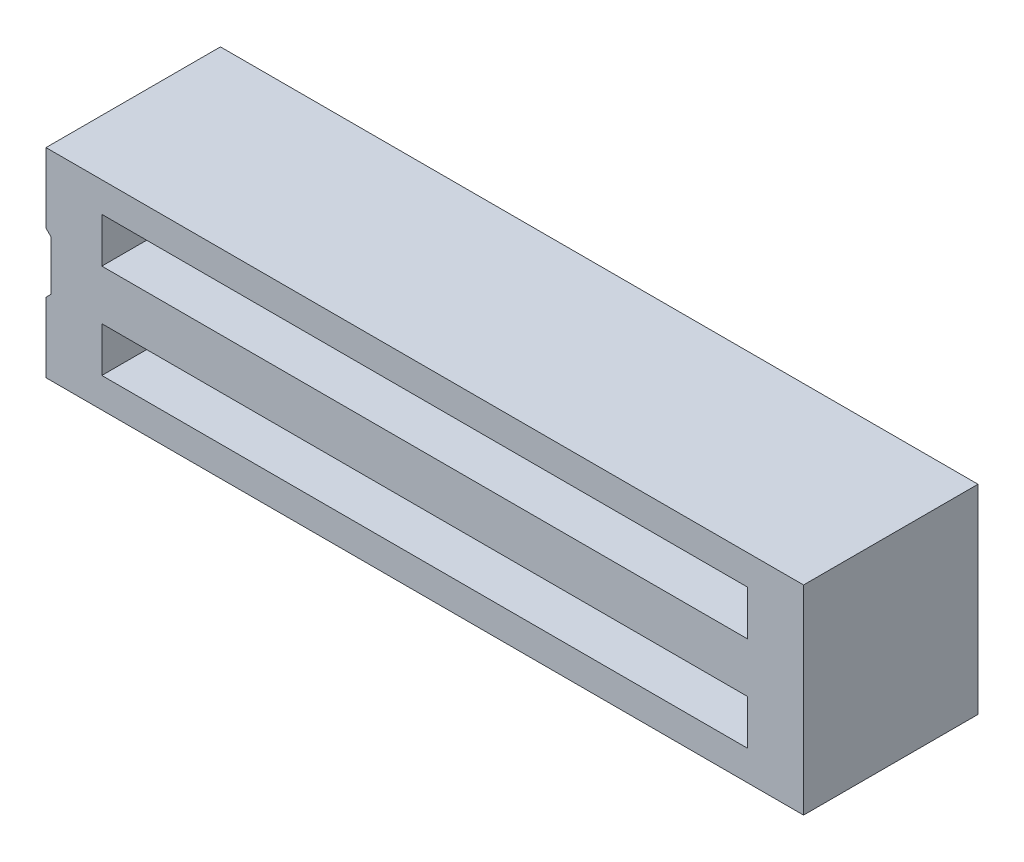
ISO-10303-21;
HEADER;
FILE_DESCRIPTION(('STEP AP214'),'2;1');
FILE_NAME('part.step','',(''),(''),'','','');
FILE_SCHEMA(('AUTOMOTIVE_DESIGN { 1 0 10303 214 1 1 1 1 }'));
ENDSEC;
DATA;
#1=APPLICATION_CONTEXT('core data for automotive mechanical design processes');
#2=APPLICATION_PROTOCOL_DEFINITION('international standard','automotive_design',2000,#1);
#3=PRODUCT_CONTEXT('',#1,'mechanical');
#4=PRODUCT('Part','Part','',(#3));
#5=PRODUCT_RELATED_PRODUCT_CATEGORY('part','',(#4));
#6=PRODUCT_DEFINITION_FORMATION('','',#4);
#7=PRODUCT_DEFINITION_CONTEXT('part definition',#1,'design');
#8=PRODUCT_DEFINITION('design','',#6,#7);
#9=PRODUCT_DEFINITION_SHAPE('','',#8);
#10=(LENGTH_UNIT() NAMED_UNIT(*) SI_UNIT(.MILLI.,.METRE.));
#11=(NAMED_UNIT(*) PLANE_ANGLE_UNIT() SI_UNIT($,.RADIAN.));
#12=(NAMED_UNIT(*) SI_UNIT($,.STERADIAN.) SOLID_ANGLE_UNIT());
#13=UNCERTAINTY_MEASURE_WITH_UNIT(LENGTH_MEASURE(1.E-05),#10,'distance_accuracy_value','');
#14=(GEOMETRIC_REPRESENTATION_CONTEXT(3) GLOBAL_UNCERTAINTY_ASSIGNED_CONTEXT((#13)) GLOBAL_UNIT_ASSIGNED_CONTEXT((#10,
#11,#12)) REPRESENTATION_CONTEXT('',''));
#15=CARTESIAN_POINT('',(0.,0.,0.));
#16=DIRECTION('',(0.,0.,1.));
#17=DIRECTION('',(1.,0.,0.));
#18=AXIS2_PLACEMENT_3D('',#15,#16,#17);
#19=CARTESIAN_POINT('',(6.48,0.49,3.51));
#20=CARTESIAN_POINT('',(6.48,0.49,0.49));
#21=CARTESIAN_POINT('',(6.48,1.41,3.51));
#22=CARTESIAN_POINT('',(6.48,1.41,0.49));
#23=(BOUNDED_SURFACE() B_SPLINE_SURFACE(1,1,((#19,#20),(#21,#22)),.UNSPECIFIED.,.F.,.F.,
.F.) B_SPLINE_SURFACE_WITH_KNOTS((2,2),(2,2),(-0.001,0.091),(-0.001,0.301),
.UNSPECIFIED.) GEOMETRIC_REPRESENTATION_ITEM() RATIONAL_B_SPLINE_SURFACE(((1.,1.),(1.,1.))) REPRESENTATION_ITEM('') SURFACE());
#24=CARTESIAN_POINT('',(6.48,1.4,3.5));
#25=CARTESIAN_POINT('',(6.48,0.5,3.5));
#26=(BOUNDED_CURVE() B_SPLINE_CURVE(1,(#24,#25),.UNSPECIFIED.,.F.,
.F.) B_SPLINE_CURVE_WITH_KNOTS((2,2),(-0.07,0.02),
.UNSPECIFIED.) CURVE() GEOMETRIC_REPRESENTATION_ITEM() RATIONAL_B_SPLINE_CURVE((1.,1.)) REPRESENTATION_ITEM(''));
#27=CARTESIAN_POINT('',(6.48,1.4,3.5));
#28=VERTEX_POINT('',#27);
#29=CARTESIAN_POINT('',(6.48,0.5,3.5));
#30=VERTEX_POINT('',#29);
#31=EDGE_CURVE('E219',#28,#30,#26,.T.);
#32=CARTESIAN_POINT('',(6.48,1.4,3.5));
#33=CARTESIAN_POINT('',(6.48,1.4,0.5));
#34=(BOUNDED_CURVE() B_SPLINE_CURVE(1,(#32,#33),.UNSPECIFIED.,.F.,
.F.) B_SPLINE_CURVE_WITH_KNOTS((2,2),(0.,0.3),
.UNSPECIFIED.) CURVE() GEOMETRIC_REPRESENTATION_ITEM() RATIONAL_B_SPLINE_CURVE((1.,1.)) REPRESENTATION_ITEM(''));
#35=CARTESIAN_POINT('',(6.48,1.4,0.5));
#36=VERTEX_POINT('',#35);
#37=EDGE_CURVE('E11',#28,#36,#34,.T.);
#38=CARTESIAN_POINT('',(6.48,1.4,0.5));
#39=CARTESIAN_POINT('',(6.48,0.5,0.5));
#40=(BOUNDED_CURVE() B_SPLINE_CURVE(1,(#38,#39),.UNSPECIFIED.,.F.,
.F.) B_SPLINE_CURVE_WITH_KNOTS((2,2),(0.,0.09),
.UNSPECIFIED.) CURVE() GEOMETRIC_REPRESENTATION_ITEM() RATIONAL_B_SPLINE_CURVE((1.,1.)) REPRESENTATION_ITEM(''));
#41=CARTESIAN_POINT('',(6.48,0.5,0.5));
#42=VERTEX_POINT('',#41);
#43=EDGE_CURVE('E209',#36,#42,#40,.T.);
#44=CARTESIAN_POINT('',(6.48,0.5,3.5));
#45=CARTESIAN_POINT('',(6.48,0.5,0.5));
#46=(BOUNDED_CURVE() B_SPLINE_CURVE(1,(#44,#45),.UNSPECIFIED.,.F.,
.F.) B_SPLINE_CURVE_WITH_KNOTS((2,2),(0.,0.3),
.UNSPECIFIED.) CURVE() GEOMETRIC_REPRESENTATION_ITEM() RATIONAL_B_SPLINE_CURVE((1.,1.)) REPRESENTATION_ITEM(''));
#47=EDGE_CURVE('E481',#30,#42,#46,.T.);
#48=ORIENTED_EDGE('',*,*,#31,.F.);
#49=ORIENTED_EDGE('',*,*,#37,.T.);
#50=ORIENTED_EDGE('',*,*,#43,.T.);
#51=ORIENTED_EDGE('',*,*,#47,.F.);
#52=EDGE_LOOP('',(#48,#49,#50,#51));
#53=FACE_BOUND('',#52,.T.);
#54=ADVANCED_FACE('F17',(#53),#23,.T.);
#55=CARTESIAN_POINT('',(6.49,1.4,3.51));
#56=CARTESIAN_POINT('',(6.49,1.4,0.49));
#57=CARTESIAN_POINT('',(-6.49,1.4,3.51));
#58=CARTESIAN_POINT('',(-6.49,1.4,0.49));
#59=(BOUNDED_SURFACE() B_SPLINE_SURFACE(1,1,((#55,#56),(#57,#58)),.UNSPECIFIED.,.F.,.F.,
.F.) B_SPLINE_SURFACE_WITH_KNOTS((2,2),(2,2),(-0.001,1.297),(-0.001,0.301),
.UNSPECIFIED.) GEOMETRIC_REPRESENTATION_ITEM() RATIONAL_B_SPLINE_SURFACE(((1.,1.),(1.,1.))) REPRESENTATION_ITEM('') SURFACE());
#60=CARTESIAN_POINT('',(-6.48,1.4,3.5));
#61=CARTESIAN_POINT('',(6.48,1.4,3.5));
#62=(BOUNDED_CURVE() B_SPLINE_CURVE(1,(#60,#61),.UNSPECIFIED.,.F.,
.F.) B_SPLINE_CURVE_WITH_KNOTS((2,2),(-0.324,0.972),
.UNSPECIFIED.) CURVE() GEOMETRIC_REPRESENTATION_ITEM() RATIONAL_B_SPLINE_CURVE((1.,1.)) REPRESENTATION_ITEM(''));
#63=CARTESIAN_POINT('',(-6.48,1.4,3.5));
#64=VERTEX_POINT('',#63);
#65=EDGE_CURVE('E277',#64,#28,#62,.T.);
#66=CARTESIAN_POINT('',(-6.48,1.4,3.5));
#67=CARTESIAN_POINT('',(-6.48,1.4,0.5));
#68=(BOUNDED_CURVE() B_SPLINE_CURVE(1,(#66,#67),.UNSPECIFIED.,.F.,
.F.) B_SPLINE_CURVE_WITH_KNOTS((2,2),(0.,0.3),
.UNSPECIFIED.) CURVE() GEOMETRIC_REPRESENTATION_ITEM() RATIONAL_B_SPLINE_CURVE((1.,1.)) REPRESENTATION_ITEM(''));
#69=CARTESIAN_POINT('',(-6.48,1.4,0.5));
#70=VERTEX_POINT('',#69);
#71=EDGE_CURVE('E23',#64,#70,#68,.T.);
#72=CARTESIAN_POINT('',(-6.48,1.4,0.5));
#73=CARTESIAN_POINT('',(6.48,1.4,0.5));
#74=(BOUNDED_CURVE() B_SPLINE_CURVE(1,(#72,#73),.UNSPECIFIED.,.F.,
.F.) B_SPLINE_CURVE_WITH_KNOTS((2,2),(0.,1.296),
.UNSPECIFIED.) CURVE() GEOMETRIC_REPRESENTATION_ITEM() RATIONAL_B_SPLINE_CURVE((1.,1.)) REPRESENTATION_ITEM(''));
#75=EDGE_CURVE('E200',#70,#36,#74,.T.);
#76=ORIENTED_EDGE('',*,*,#65,.F.);
#77=ORIENTED_EDGE('',*,*,#71,.T.);
#78=ORIENTED_EDGE('',*,*,#75,.T.);
#79=ORIENTED_EDGE('',*,*,#37,.F.);
#80=EDGE_LOOP('',(#76,#77,#78,#79));
#81=FACE_BOUND('',#80,.T.);
#82=ADVANCED_FACE('F609',(#81),#59,.T.);
#83=CARTESIAN_POINT('',(-6.48,1.41,3.51));
#84=CARTESIAN_POINT('',(-6.48,1.41,0.49));
#85=CARTESIAN_POINT('',(-6.48,0.49,3.51));
#86=CARTESIAN_POINT('',(-6.48,0.49,0.49));
#87=(BOUNDED_SURFACE() B_SPLINE_SURFACE(1,1,((#83,#84),(#85,#86)),.UNSPECIFIED.,.F.,.F.,
.F.) B_SPLINE_SURFACE_WITH_KNOTS((2,2),(2,2),(-0.001,0.091),(-0.001,0.301),
.UNSPECIFIED.) GEOMETRIC_REPRESENTATION_ITEM() RATIONAL_B_SPLINE_SURFACE(((1.,1.),(1.,1.))) REPRESENTATION_ITEM('') SURFACE());
#88=CARTESIAN_POINT('',(-6.48,0.5,3.5));
#89=CARTESIAN_POINT('',(-6.48,1.4,3.5));
#90=(BOUNDED_CURVE() B_SPLINE_CURVE(1,(#88,#89),.UNSPECIFIED.,.F.,
.F.) B_SPLINE_CURVE_WITH_KNOTS((2,2),(0.025,0.115),
.UNSPECIFIED.) CURVE() GEOMETRIC_REPRESENTATION_ITEM() RATIONAL_B_SPLINE_CURVE((1.,1.)) REPRESENTATION_ITEM(''));
#91=CARTESIAN_POINT('',(-6.48,0.5,3.5));
#92=VERTEX_POINT('',#91);
#93=EDGE_CURVE('E268',#92,#64,#90,.T.);
#94=CARTESIAN_POINT('',(-6.48,0.5,3.5));
#95=CARTESIAN_POINT('',(-6.48,0.5,0.5));
#96=(BOUNDED_CURVE() B_SPLINE_CURVE(1,(#94,#95),.UNSPECIFIED.,.F.,
.F.) B_SPLINE_CURVE_WITH_KNOTS((2,2),(0.,0.3),
.UNSPECIFIED.) CURVE() GEOMETRIC_REPRESENTATION_ITEM() RATIONAL_B_SPLINE_CURVE((1.,1.)) REPRESENTATION_ITEM(''));
#97=CARTESIAN_POINT('',(-6.48,0.5,0.5));
#98=VERTEX_POINT('',#97);
#99=EDGE_CURVE('E473',#92,#98,#96,.T.);
#100=CARTESIAN_POINT('',(-6.48,0.5,0.5));
#101=CARTESIAN_POINT('',(-6.48,1.4,0.5));
#102=(BOUNDED_CURVE() B_SPLINE_CURVE(1,(#100,#101),.UNSPECIFIED.,.F.,
.F.) B_SPLINE_CURVE_WITH_KNOTS((2,2),(0.,0.09),
.UNSPECIFIED.) CURVE() GEOMETRIC_REPRESENTATION_ITEM() RATIONAL_B_SPLINE_CURVE((1.,1.)) REPRESENTATION_ITEM(''));
#103=EDGE_CURVE('E208',#98,#70,#102,.T.);
#104=ORIENTED_EDGE('',*,*,#93,.F.);
#105=ORIENTED_EDGE('',*,*,#99,.T.);
#106=ORIENTED_EDGE('',*,*,#103,.T.);
#107=ORIENTED_EDGE('',*,*,#71,.F.);
#108=EDGE_LOOP('',(#104,#105,#106,#107));
#109=FACE_BOUND('',#108,.T.);
#110=ADVANCED_FACE('F622',(#109),#87,.T.);
#111=CARTESIAN_POINT('',(-6.49,0.5,3.51));
#112=CARTESIAN_POINT('',(-6.49,0.5,0.49));
#113=CARTESIAN_POINT('',(6.49,0.5,3.51));
#114=CARTESIAN_POINT('',(6.49,0.5,0.49));
#115=(BOUNDED_SURFACE() B_SPLINE_SURFACE(1,1,((#111,#112),(#113,#114)),.UNSPECIFIED.,.F.,.F.,
.F.) B_SPLINE_SURFACE_WITH_KNOTS((2,2),(2,2),(-0.001,1.297),(-0.001,0.301),
.UNSPECIFIED.) GEOMETRIC_REPRESENTATION_ITEM() RATIONAL_B_SPLINE_SURFACE(((1.,1.),(1.,1.))) REPRESENTATION_ITEM('') SURFACE());
#116=CARTESIAN_POINT('',(6.48,0.5,3.5));
#117=CARTESIAN_POINT('',(-6.48,0.5,3.5));
#118=(BOUNDED_CURVE() B_SPLINE_CURVE(1,(#116,#117),.UNSPECIFIED.,.F.,
.F.) B_SPLINE_CURVE_WITH_KNOTS((2,2),(-0.324,0.972),
.UNSPECIFIED.) CURVE() GEOMETRIC_REPRESENTATION_ITEM() RATIONAL_B_SPLINE_CURVE((1.,1.)) REPRESENTATION_ITEM(''));
#119=EDGE_CURVE('E259',#30,#92,#118,.T.);
#120=CARTESIAN_POINT('',(6.48,0.5,0.5));
#121=CARTESIAN_POINT('',(-6.48,0.5,0.5));
#122=(BOUNDED_CURVE() B_SPLINE_CURVE(1,(#120,#121),.UNSPECIFIED.,.F.,
.F.) B_SPLINE_CURVE_WITH_KNOTS((2,2),(0.,1.296),
.UNSPECIFIED.) CURVE() GEOMETRIC_REPRESENTATION_ITEM() RATIONAL_B_SPLINE_CURVE((1.,1.)) REPRESENTATION_ITEM(''));
#123=EDGE_CURVE('E296',#42,#98,#122,.T.);
#124=ORIENTED_EDGE('',*,*,#119,.F.);
#125=ORIENTED_EDGE('',*,*,#47,.T.);
#126=ORIENTED_EDGE('',*,*,#123,.T.);
#127=ORIENTED_EDGE('',*,*,#99,.F.);
#128=EDGE_LOOP('',(#124,#125,#126,#127));
#129=FACE_BOUND('',#128,.T.);
#130=ADVANCED_FACE('F19',(#129),#115,.T.);
#131=CARTESIAN_POINT('',(-6.49,0.49,0.5));
#132=CARTESIAN_POINT('',(-6.49,1.41,0.5));
#133=CARTESIAN_POINT('',(6.49,0.49,0.5));
#134=CARTESIAN_POINT('',(6.49,1.41,0.5));
#135=(BOUNDED_SURFACE() B_SPLINE_SURFACE(1,1,((#131,#132),(#133,#134)),.UNSPECIFIED.,.F.,.F.,
.F.) B_SPLINE_SURFACE_WITH_KNOTS((2,2),(2,2),(-0.649,0.649),(-0.046,0.046),
.UNSPECIFIED.) GEOMETRIC_REPRESENTATION_ITEM() RATIONAL_B_SPLINE_SURFACE(((1.,1.),(1.,1.))) REPRESENTATION_ITEM('') SURFACE());
#136=ORIENTED_EDGE('',*,*,#123,.F.);
#137=ORIENTED_EDGE('',*,*,#43,.F.);
#138=ORIENTED_EDGE('',*,*,#75,.F.);
#139=ORIENTED_EDGE('',*,*,#103,.F.);
#140=EDGE_LOOP('',(#136,#137,#138,#139));
#141=FACE_BOUND('',#140,.T.);
#142=ADVANCED_FACE('F727',(#141),#135,.T.);
#143=CARTESIAN_POINT('',(-6.48,-0.49,3.51));
#144=CARTESIAN_POINT('',(-6.48,-0.49,0.49));
#145=CARTESIAN_POINT('',(-6.48,-1.41,3.51));
#146=CARTESIAN_POINT('',(-6.48,-1.41,0.49));
#147=(BOUNDED_SURFACE() B_SPLINE_SURFACE(1,1,((#143,#144),(#145,#146)),.UNSPECIFIED.,.F.,.F.,
.F.) B_SPLINE_SURFACE_WITH_KNOTS((2,2),(2,2),(-0.001,0.091),(-0.001,0.301),
.UNSPECIFIED.) GEOMETRIC_REPRESENTATION_ITEM() RATIONAL_B_SPLINE_SURFACE(((1.,1.),(1.,1.))) REPRESENTATION_ITEM('') SURFACE());
#148=CARTESIAN_POINT('',(-6.48,-1.4,3.5));
#149=CARTESIAN_POINT('',(-6.48,-0.5,3.5));
#150=(BOUNDED_CURVE() B_SPLINE_CURVE(1,(#148,#149),.UNSPECIFIED.,.F.,
.F.) B_SPLINE_CURVE_WITH_KNOTS((2,2),(-0.07,0.02),
.UNSPECIFIED.) CURVE() GEOMETRIC_REPRESENTATION_ITEM() RATIONAL_B_SPLINE_CURVE((1.,1.)) REPRESENTATION_ITEM(''));
#151=CARTESIAN_POINT('',(-6.48,-1.4,3.5));
#152=VERTEX_POINT('',#151);
#153=CARTESIAN_POINT('',(-6.48,-0.5,3.5));
#154=VERTEX_POINT('',#153);
#155=EDGE_CURVE('E181',#152,#154,#150,.T.);
#156=CARTESIAN_POINT('',(-6.48,-1.4,3.5));
#157=CARTESIAN_POINT('',(-6.48,-1.4,0.5));
#158=(BOUNDED_CURVE() B_SPLINE_CURVE(1,(#156,#157),.UNSPECIFIED.,.F.,
.F.) B_SPLINE_CURVE_WITH_KNOTS((2,2),(0.,0.3),
.UNSPECIFIED.) CURVE() GEOMETRIC_REPRESENTATION_ITEM() RATIONAL_B_SPLINE_CURVE((1.,1.)) REPRESENTATION_ITEM(''));
#159=CARTESIAN_POINT('',(-6.48,-1.4,0.5));
#160=VERTEX_POINT('',#159);
#161=EDGE_CURVE('E305',#152,#160,#158,.T.);
#162=CARTESIAN_POINT('',(-6.48,-1.4,0.5));
#163=CARTESIAN_POINT('',(-6.48,-0.5,0.5));
#164=(BOUNDED_CURVE() B_SPLINE_CURVE(1,(#162,#163),.UNSPECIFIED.,.F.,
.F.) B_SPLINE_CURVE_WITH_KNOTS((2,2),(0.,0.09),
.UNSPECIFIED.) CURVE() GEOMETRIC_REPRESENTATION_ITEM() RATIONAL_B_SPLINE_CURVE((1.,1.)) REPRESENTATION_ITEM(''));
#165=CARTESIAN_POINT('',(-6.48,-0.5,0.5));
#166=VERTEX_POINT('',#165);
#167=EDGE_CURVE('E427',#160,#166,#164,.T.);
#168=CARTESIAN_POINT('',(-6.48,-0.5,3.5));
#169=CARTESIAN_POINT('',(-6.48,-0.5,0.5));
#170=(BOUNDED_CURVE() B_SPLINE_CURVE(1,(#168,#169),.UNSPECIFIED.,.F.,
.F.) B_SPLINE_CURVE_WITH_KNOTS((2,2),(0.,0.3),
.UNSPECIFIED.) CURVE() GEOMETRIC_REPRESENTATION_ITEM() RATIONAL_B_SPLINE_CURVE((1.,1.)) REPRESENTATION_ITEM(''));
#171=EDGE_CURVE('E241',#154,#166,#170,.T.);
#172=ORIENTED_EDGE('',*,*,#155,.F.);
#173=ORIENTED_EDGE('',*,*,#161,.T.);
#174=ORIENTED_EDGE('',*,*,#167,.T.);
#175=ORIENTED_EDGE('',*,*,#171,.F.);
#176=EDGE_LOOP('',(#172,#173,#174,#175));
#177=FACE_BOUND('',#176,.T.);
#178=ADVANCED_FACE('F590',(#177),#147,.T.);
#179=CARTESIAN_POINT('',(-6.49,-1.4,3.51));
#180=CARTESIAN_POINT('',(-6.49,-1.4,0.49));
#181=CARTESIAN_POINT('',(6.49,-1.4,3.51));
#182=CARTESIAN_POINT('',(6.49,-1.4,0.49));
#183=(BOUNDED_SURFACE() B_SPLINE_SURFACE(1,1,((#179,#180),(#181,#182)),.UNSPECIFIED.,.F.,.F.,
.F.) B_SPLINE_SURFACE_WITH_KNOTS((2,2),(2,2),(-0.001,1.297),(-0.001,0.301),
.UNSPECIFIED.) GEOMETRIC_REPRESENTATION_ITEM() RATIONAL_B_SPLINE_SURFACE(((1.,1.),(1.,1.))) REPRESENTATION_ITEM('') SURFACE());
#184=CARTESIAN_POINT('',(6.48,-1.4,3.5));
#185=CARTESIAN_POINT('',(-6.48,-1.4,3.5));
#186=(BOUNDED_CURVE() B_SPLINE_CURVE(1,(#184,#185),.UNSPECIFIED.,.F.,
.F.) B_SPLINE_CURVE_WITH_KNOTS((2,2),(-0.324,0.972),
.UNSPECIFIED.) CURVE() GEOMETRIC_REPRESENTATION_ITEM() RATIONAL_B_SPLINE_CURVE((1.,1.)) REPRESENTATION_ITEM(''));
#187=CARTESIAN_POINT('',(6.48,-1.4,3.5));
#188=VERTEX_POINT('',#187);
#189=EDGE_CURVE('E210',#188,#152,#186,.T.);
#190=CARTESIAN_POINT('',(6.48,-1.4,3.5));
#191=CARTESIAN_POINT('',(6.48,-1.4,0.5));
#192=(BOUNDED_CURVE() B_SPLINE_CURVE(1,(#190,#191),.UNSPECIFIED.,.F.,
.F.) B_SPLINE_CURVE_WITH_KNOTS((2,2),(0.,0.3),
.UNSPECIFIED.) CURVE() GEOMETRIC_REPRESENTATION_ITEM() RATIONAL_B_SPLINE_CURVE((1.,1.)) REPRESENTATION_ITEM(''));
#193=CARTESIAN_POINT('',(6.48,-1.4,0.5));
#194=VERTEX_POINT('',#193);
#195=EDGE_CURVE('E240',#188,#194,#192,.T.);
#196=CARTESIAN_POINT('',(6.48,-1.4,0.5));
#197=CARTESIAN_POINT('',(-6.48,-1.4,0.5));
#198=(BOUNDED_CURVE() B_SPLINE_CURVE(1,(#196,#197),.UNSPECIFIED.,.F.,
.F.) B_SPLINE_CURVE_WITH_KNOTS((2,2),(0.,1.296),
.UNSPECIFIED.) CURVE() GEOMETRIC_REPRESENTATION_ITEM() RATIONAL_B_SPLINE_CURVE((1.,1.)) REPRESENTATION_ITEM(''));
#199=EDGE_CURVE('E429',#194,#160,#198,.T.);
#200=ORIENTED_EDGE('',*,*,#189,.F.);
#201=ORIENTED_EDGE('',*,*,#195,.T.);
#202=ORIENTED_EDGE('',*,*,#199,.T.);
#203=ORIENTED_EDGE('',*,*,#161,.F.);
#204=EDGE_LOOP('',(#200,#201,#202,#203));
#205=FACE_BOUND('',#204,.T.);
#206=ADVANCED_FACE('F576',(#205),#183,.T.);
#207=CARTESIAN_POINT('',(6.48,-1.41,3.51));
#208=CARTESIAN_POINT('',(6.48,-1.41,0.49));
#209=CARTESIAN_POINT('',(6.48,-0.49,3.51));
#210=CARTESIAN_POINT('',(6.48,-0.49,0.49));
#211=(BOUNDED_SURFACE() B_SPLINE_SURFACE(1,1,((#207,#208),(#209,#210)),.UNSPECIFIED.,.F.,.F.,
.F.) B_SPLINE_SURFACE_WITH_KNOTS((2,2),(2,2),(-0.001,0.091),(-0.001,0.301),
.UNSPECIFIED.) GEOMETRIC_REPRESENTATION_ITEM() RATIONAL_B_SPLINE_SURFACE(((1.,1.),(1.,1.))) REPRESENTATION_ITEM('') SURFACE());
#212=CARTESIAN_POINT('',(6.48,-0.5,3.5));
#213=CARTESIAN_POINT('',(6.48,-1.4,3.5));
#214=(BOUNDED_CURVE() B_SPLINE_CURVE(1,(#212,#213),.UNSPECIFIED.,.F.,
.F.) B_SPLINE_CURVE_WITH_KNOTS((2,2),(0.025,0.115),
.UNSPECIFIED.) CURVE() GEOMETRIC_REPRESENTATION_ITEM() RATIONAL_B_SPLINE_CURVE((1.,1.)) REPRESENTATION_ITEM(''));
#215=CARTESIAN_POINT('',(6.48,-0.5,3.5));
#216=VERTEX_POINT('',#215);
#217=EDGE_CURVE('E220',#216,#188,#214,.T.);
#218=CARTESIAN_POINT('',(6.48,-0.5,3.5));
#219=CARTESIAN_POINT('',(6.48,-0.5,0.5));
#220=(BOUNDED_CURVE() B_SPLINE_CURVE(1,(#218,#219),.UNSPECIFIED.,.F.,
.F.) B_SPLINE_CURVE_WITH_KNOTS((2,2),(0.,0.3),
.UNSPECIFIED.) CURVE() GEOMETRIC_REPRESENTATION_ITEM() RATIONAL_B_SPLINE_CURVE((1.,1.)) REPRESENTATION_ITEM(''));
#221=CARTESIAN_POINT('',(6.48,-0.5,0.5));
#222=VERTEX_POINT('',#221);
#223=EDGE_CURVE('E231',#216,#222,#220,.T.);
#224=CARTESIAN_POINT('',(6.48,-0.5,0.5));
#225=CARTESIAN_POINT('',(6.48,-1.4,0.5));
#226=(BOUNDED_CURVE() B_SPLINE_CURVE(1,(#224,#225),.UNSPECIFIED.,.F.,
.F.) B_SPLINE_CURVE_WITH_KNOTS((2,2),(0.,0.09),
.UNSPECIFIED.) CURVE() GEOMETRIC_REPRESENTATION_ITEM() RATIONAL_B_SPLINE_CURVE((1.,1.)) REPRESENTATION_ITEM(''));
#227=EDGE_CURVE('E333',#222,#194,#226,.T.);
#228=ORIENTED_EDGE('',*,*,#217,.F.);
#229=ORIENTED_EDGE('',*,*,#223,.T.);
#230=ORIENTED_EDGE('',*,*,#227,.T.);
#231=ORIENTED_EDGE('',*,*,#195,.F.);
#232=EDGE_LOOP('',(#228,#229,#230,#231));
#233=FACE_BOUND('',#232,.T.);
#234=ADVANCED_FACE('F584',(#233),#211,.T.);
#235=CARTESIAN_POINT('',(6.49,-0.5,3.51));
#236=CARTESIAN_POINT('',(6.49,-0.5,0.49));
#237=CARTESIAN_POINT('',(-6.49,-0.5,3.51));
#238=CARTESIAN_POINT('',(-6.49,-0.5,0.49));
#239=(BOUNDED_SURFACE() B_SPLINE_SURFACE(1,1,((#235,#236),(#237,#238)),.UNSPECIFIED.,.F.,.F.,
.F.) B_SPLINE_SURFACE_WITH_KNOTS((2,2),(2,2),(-0.001,1.297),(-0.001,0.301),
.UNSPECIFIED.) GEOMETRIC_REPRESENTATION_ITEM() RATIONAL_B_SPLINE_SURFACE(((1.,1.),(1.,1.))) REPRESENTATION_ITEM('') SURFACE());
#240=CARTESIAN_POINT('',(-6.48,-0.5,3.5));
#241=CARTESIAN_POINT('',(6.48,-0.5,3.5));
#242=(BOUNDED_CURVE() B_SPLINE_CURVE(1,(#240,#241),.UNSPECIFIED.,.F.,
.F.) B_SPLINE_CURVE_WITH_KNOTS((2,2),(-0.324,0.972),
.UNSPECIFIED.) CURVE() GEOMETRIC_REPRESENTATION_ITEM() RATIONAL_B_SPLINE_CURVE((1.,1.)) REPRESENTATION_ITEM(''));
#243=EDGE_CURVE('E242',#154,#216,#242,.T.);
#244=CARTESIAN_POINT('',(-6.48,-0.5,0.5));
#245=CARTESIAN_POINT('',(6.48,-0.5,0.5));
#246=(BOUNDED_CURVE() B_SPLINE_CURVE(1,(#244,#245),.UNSPECIFIED.,.F.,
.F.) B_SPLINE_CURVE_WITH_KNOTS((2,2),(0.,1.296),
.UNSPECIFIED.) CURVE() GEOMETRIC_REPRESENTATION_ITEM() RATIONAL_B_SPLINE_CURVE((1.,1.)) REPRESENTATION_ITEM(''));
#247=EDGE_CURVE('E418',#166,#222,#246,.T.);
#248=ORIENTED_EDGE('',*,*,#243,.F.);
#249=ORIENTED_EDGE('',*,*,#171,.T.);
#250=ORIENTED_EDGE('',*,*,#247,.T.);
#251=ORIENTED_EDGE('',*,*,#223,.F.);
#252=EDGE_LOOP('',(#248,#249,#250,#251));
#253=FACE_BOUND('',#252,.T.);
#254=ADVANCED_FACE('F650',(#253),#239,.T.);
#255=CARTESIAN_POINT('',(-6.49,-1.41,0.5));
#256=CARTESIAN_POINT('',(-6.49,-0.49,0.5));
#257=CARTESIAN_POINT('',(6.49,-1.41,0.5));
#258=CARTESIAN_POINT('',(6.49,-0.49,0.5));
#259=(BOUNDED_SURFACE() B_SPLINE_SURFACE(1,1,((#255,#256),(#257,#258)),.UNSPECIFIED.,.F.,.F.,
.F.) B_SPLINE_SURFACE_WITH_KNOTS((2,2),(2,2),(-0.649,0.649),(-0.046,0.046),
.UNSPECIFIED.) GEOMETRIC_REPRESENTATION_ITEM() RATIONAL_B_SPLINE_SURFACE(((1.,1.),(1.,1.))) REPRESENTATION_ITEM('') SURFACE());
#260=ORIENTED_EDGE('',*,*,#247,.F.);
#261=ORIENTED_EDGE('',*,*,#167,.F.);
#262=ORIENTED_EDGE('',*,*,#199,.F.);
#263=ORIENTED_EDGE('',*,*,#227,.F.);
#264=EDGE_LOOP('',(#260,#261,#262,#263));
#265=FACE_BOUND('',#264,.T.);
#266=ADVANCED_FACE('F587',(#265),#259,.T.);
#267=CARTESIAN_POINT('',(-7.492928934423,-0.492928965716,-0.01));
#268=CARTESIAN_POINT('',(-7.492928934423,-0.492928965716,3.51));
#269=CARTESIAN_POINT('',(-7.607071067812,-0.607071099104,-0.01));
#270=CARTESIAN_POINT('',(-7.607071067812,-0.607071099104,3.51));
#271=(BOUNDED_SURFACE() B_SPLINE_SURFACE(1,1,((#267,#268),(#269,#270)),.UNSPECIFIED.,.F.,.F.,
.F.) B_SPLINE_SURFACE_WITH_KNOTS((2,2),(2,2),(-0.001,0.01514213530763),(-0.001,0.351),
.UNSPECIFIED.) GEOMETRIC_REPRESENTATION_ITEM() RATIONAL_B_SPLINE_SURFACE(((1.,1.),(1.,1.))) REPRESENTATION_ITEM('') SURFACE());
#272=CARTESIAN_POINT('',(-7.500000002235,-0.500000033528,0.));
#273=CARTESIAN_POINT('',(-7.6,-0.600000031292,0.));
#274=(BOUNDED_CURVE() B_SPLINE_CURVE(1,(#272,#273),.UNSPECIFIED.,.F.,
.F.) B_SPLINE_CURVE_WITH_KNOTS((2,2),(0.,0.01414213530763),
.UNSPECIFIED.) CURVE() GEOMETRIC_REPRESENTATION_ITEM() RATIONAL_B_SPLINE_CURVE((1.,1.)) REPRESENTATION_ITEM(''));
#275=CARTESIAN_POINT('',(-7.500000002235,-0.500000033528,0.));
#276=VERTEX_POINT('',#275);
#277=CARTESIAN_POINT('',(-7.6,-0.600000031292,0.));
#278=VERTEX_POINT('',#277);
#279=EDGE_CURVE('E185',#276,#278,#274,.T.);
#280=CARTESIAN_POINT('',(-7.6,-0.600000031292,0.));
#281=CARTESIAN_POINT('',(-7.6,-0.600000031292,3.5));
#282=(BOUNDED_CURVE() B_SPLINE_CURVE(1,(#280,#281),.UNSPECIFIED.,.F.,
.F.) B_SPLINE_CURVE_WITH_KNOTS((2,2),(0.,0.35),
.UNSPECIFIED.) CURVE() GEOMETRIC_REPRESENTATION_ITEM() RATIONAL_B_SPLINE_CURVE((1.,1.)) REPRESENTATION_ITEM(''));
#283=CARTESIAN_POINT('',(-7.6,-0.600000031292,3.5));
#284=VERTEX_POINT('',#283);
#285=EDGE_CURVE('E99',#278,#284,#282,.T.);
#286=CARTESIAN_POINT('',(-7.500000002235,-0.500000033528,3.5));
#287=CARTESIAN_POINT('',(-7.6,-0.600000031292,3.5));
#288=(BOUNDED_CURVE() B_SPLINE_CURVE(1,(#286,#287),.UNSPECIFIED.,.F.,
.F.) B_SPLINE_CURVE_WITH_KNOTS((2,2),(0.,0.01414213530763),
.UNSPECIFIED.) CURVE() GEOMETRIC_REPRESENTATION_ITEM() RATIONAL_B_SPLINE_CURVE((1.,1.)) REPRESENTATION_ITEM(''));
#289=CARTESIAN_POINT('',(-7.500000002235,-0.500000033528,3.5));
#290=VERTEX_POINT('',#289);
#291=EDGE_CURVE('E170',#290,#284,#288,.T.);
#292=CARTESIAN_POINT('',(-7.500000002235,-0.500000033528,0.));
#293=CARTESIAN_POINT('',(-7.500000002235,-0.500000033528,3.5));
#294=(BOUNDED_CURVE() B_SPLINE_CURVE(1,(#292,#293),.UNSPECIFIED.,.F.,
.F.) B_SPLINE_CURVE_WITH_KNOTS((2,2),(0.,0.35),
.UNSPECIFIED.) CURVE() GEOMETRIC_REPRESENTATION_ITEM() RATIONAL_B_SPLINE_CURVE((1.,1.)) REPRESENTATION_ITEM(''));
#295=EDGE_CURVE('E428',#276,#290,#294,.T.);
#296=ORIENTED_EDGE('',*,*,#279,.T.);
#297=ORIENTED_EDGE('',*,*,#285,.T.);
#298=ORIENTED_EDGE('',*,*,#291,.F.);
#299=ORIENTED_EDGE('',*,*,#295,.F.);
#300=EDGE_LOOP('',(#296,#297,#298,#299));
#301=FACE_BOUND('',#300,.T.);
#302=ADVANCED_FACE('F677',(#301),#271,.T.);
#303=CARTESIAN_POINT('',(-7.500000002235,0.509999944121,-0.01));
#304=CARTESIAN_POINT('',(-7.500000002235,0.509999944121,3.51));
#305=CARTESIAN_POINT('',(-7.500000002235,-0.510000033528,-0.01));
#306=CARTESIAN_POINT('',(-7.500000002235,-0.510000033528,3.51));
#307=(BOUNDED_SURFACE() B_SPLINE_SURFACE(1,1,((#303,#304),(#305,#306)),.UNSPECIFIED.,.F.,.F.,
.F.) B_SPLINE_SURFACE_WITH_KNOTS((2,2),(2,2),(-0.001,0.100999997765),(-0.001,0.351),
.UNSPECIFIED.) GEOMETRIC_REPRESENTATION_ITEM() RATIONAL_B_SPLINE_SURFACE(((1.,1.),(1.,1.))) REPRESENTATION_ITEM('') SURFACE());
#308=CARTESIAN_POINT('',(-7.500000002235,0.499999944121,0.));
#309=CARTESIAN_POINT('',(-7.500000002235,-0.500000033528,0.));
#310=(BOUNDED_CURVE() B_SPLINE_CURVE(1,(#308,#309),.UNSPECIFIED.,.F.,
.F.) B_SPLINE_CURVE_WITH_KNOTS((2,2),(0.,0.09999999776483),
.UNSPECIFIED.) CURVE() GEOMETRIC_REPRESENTATION_ITEM() RATIONAL_B_SPLINE_CURVE((1.,1.)) REPRESENTATION_ITEM(''));
#311=CARTESIAN_POINT('',(-7.500000002235,0.499999944121,0.));
#312=VERTEX_POINT('',#311);
#313=EDGE_CURVE('E191',#312,#276,#310,.T.);
#314=CARTESIAN_POINT('',(-7.500000002235,0.499999944121,3.5));
#315=CARTESIAN_POINT('',(-7.500000002235,-0.500000033528,3.5));
#316=(BOUNDED_CURVE() B_SPLINE_CURVE(1,(#314,#315),.UNSPECIFIED.,.F.,
.F.) B_SPLINE_CURVE_WITH_KNOTS((2,2),(0.,0.09999999776483),
.UNSPECIFIED.) CURVE() GEOMETRIC_REPRESENTATION_ITEM() RATIONAL_B_SPLINE_CURVE((1.,1.)) REPRESENTATION_ITEM(''));
#317=CARTESIAN_POINT('',(-7.500000002235,0.499999944121,3.5));
#318=VERTEX_POINT('',#317);
#319=EDGE_CURVE('E371',#318,#290,#316,.T.);
#320=CARTESIAN_POINT('',(-7.500000002235,0.499999944121,0.));
#321=CARTESIAN_POINT('',(-7.500000002235,0.499999944121,3.5));
#322=(BOUNDED_CURVE() B_SPLINE_CURVE(1,(#320,#321),.UNSPECIFIED.,.F.,
.F.) B_SPLINE_CURVE_WITH_KNOTS((2,2),(0.,0.35),
.UNSPECIFIED.) CURVE() GEOMETRIC_REPRESENTATION_ITEM() RATIONAL_B_SPLINE_CURVE((1.,1.)) REPRESENTATION_ITEM(''));
#323=EDGE_CURVE('E230',#312,#318,#322,.T.);
#324=ORIENTED_EDGE('',*,*,#313,.T.);
#325=ORIENTED_EDGE('',*,*,#295,.T.);
#326=ORIENTED_EDGE('',*,*,#319,.F.);
#327=ORIENTED_EDGE('',*,*,#323,.F.);
#328=EDGE_LOOP('',(#324,#325,#326,#327));
#329=FACE_BOUND('',#328,.T.);
#330=ADVANCED_FACE('F688',(#329),#307,.T.);
#331=CARTESIAN_POINT('',(-7.607071067812,0.607071009697,-0.01));
#332=CARTESIAN_POINT('',(-7.607071067812,0.607071009697,3.51));
#333=CARTESIAN_POINT('',(-7.492928934423,0.492928876309,-0.01));
#334=CARTESIAN_POINT('',(-7.492928934423,0.492928876309,3.51));
#335=(BOUNDED_SURFACE() B_SPLINE_SURFACE(1,1,((#331,#332),(#333,#334)),.UNSPECIFIED.,.F.,.F.,
.F.) B_SPLINE_SURFACE_WITH_KNOTS((2,2),(2,2),(-0.001,0.01514213530763),(-0.001,0.351),
.UNSPECIFIED.) GEOMETRIC_REPRESENTATION_ITEM() RATIONAL_B_SPLINE_SURFACE(((1.,1.),(1.,1.))) REPRESENTATION_ITEM('') SURFACE());
#336=CARTESIAN_POINT('',(-7.6,0.599999941885,0.));
#337=CARTESIAN_POINT('',(-7.500000002235,0.499999944121,0.));
#338=(BOUNDED_CURVE() B_SPLINE_CURVE(1,(#336,#337),.UNSPECIFIED.,.F.,
.F.) B_SPLINE_CURVE_WITH_KNOTS((2,2),(0.,0.01414213530763),
.UNSPECIFIED.) CURVE() GEOMETRIC_REPRESENTATION_ITEM() RATIONAL_B_SPLINE_CURVE((1.,1.)) REPRESENTATION_ITEM(''));
#339=CARTESIAN_POINT('',(-7.6,0.599999941885,0.));
#340=VERTEX_POINT('',#339);
#341=EDGE_CURVE('E324',#340,#312,#338,.T.);
#342=CARTESIAN_POINT('',(-7.6,0.599999941885,3.5));
#343=CARTESIAN_POINT('',(-7.500000002235,0.499999944121,3.5));
#344=(BOUNDED_CURVE() B_SPLINE_CURVE(1,(#342,#343),.UNSPECIFIED.,.F.,
.F.) B_SPLINE_CURVE_WITH_KNOTS((2,2),(0.,0.01414213530763),
.UNSPECIFIED.) CURVE() GEOMETRIC_REPRESENTATION_ITEM() RATIONAL_B_SPLINE_CURVE((1.,1.)) REPRESENTATION_ITEM(''));
#345=CARTESIAN_POINT('',(-7.6,0.599999941885,3.5));
#346=VERTEX_POINT('',#345);
#347=EDGE_CURVE('E409',#346,#318,#344,.T.);
#348=CARTESIAN_POINT('',(-7.6,0.599999941885,0.));
#349=CARTESIAN_POINT('',(-7.6,0.599999941885,3.5));
#350=(BOUNDED_CURVE() B_SPLINE_CURVE(1,(#348,#349),.UNSPECIFIED.,.F.,
.F.) B_SPLINE_CURVE_WITH_KNOTS((2,2),(0.,0.35),
.UNSPECIFIED.) CURVE() GEOMETRIC_REPRESENTATION_ITEM() RATIONAL_B_SPLINE_CURVE((1.,1.)) REPRESENTATION_ITEM(''));
#351=EDGE_CURVE('E221',#340,#346,#350,.T.);
#352=ORIENTED_EDGE('',*,*,#341,.T.);
#353=ORIENTED_EDGE('',*,*,#323,.T.);
#354=ORIENTED_EDGE('',*,*,#347,.F.);
#355=ORIENTED_EDGE('',*,*,#351,.F.);
#356=EDGE_LOOP('',(#352,#353,#354,#355));
#357=FACE_BOUND('',#356,.T.);
#358=ADVANCED_FACE('F678',(#357),#335,.T.);
#359=CARTESIAN_POINT('',(-7.6,2.01,-0.01));
#360=CARTESIAN_POINT('',(-7.6,2.01,3.51));
#361=CARTESIAN_POINT('',(-7.6,0.589999941885,-0.01));
#362=CARTESIAN_POINT('',(-7.6,0.589999941885,3.51));
#363=(BOUNDED_SURFACE() B_SPLINE_SURFACE(1,1,((#359,#360),(#361,#362)),.UNSPECIFIED.,.F.,.F.,
.F.) B_SPLINE_SURFACE_WITH_KNOTS((2,2),(2,2),(-0.001,0.141000005811),(-0.001,0.351),
.UNSPECIFIED.) GEOMETRIC_REPRESENTATION_ITEM() RATIONAL_B_SPLINE_SURFACE(((1.,1.),(1.,1.))) REPRESENTATION_ITEM('') SURFACE());
#364=CARTESIAN_POINT('',(-7.6,2.,0.));
#365=CARTESIAN_POINT('',(-7.6,0.599999941885,0.));
#366=(BOUNDED_CURVE() B_SPLINE_CURVE(1,(#364,#365),.UNSPECIFIED.,.F.,
.F.) B_SPLINE_CURVE_WITH_KNOTS((2,2),(0.,0.140000005811),
.UNSPECIFIED.) CURVE() GEOMETRIC_REPRESENTATION_ITEM() RATIONAL_B_SPLINE_CURVE((1.,1.)) REPRESENTATION_ITEM(''));
#367=CARTESIAN_POINT('',(-7.6,2.,0.));
#368=VERTEX_POINT('',#367);
#369=EDGE_CURVE('E315',#368,#340,#366,.T.);
#370=CARTESIAN_POINT('',(-7.6,2.,3.5));
#371=CARTESIAN_POINT('',(-7.6,0.599999941885,3.5));
#372=(BOUNDED_CURVE() B_SPLINE_CURVE(1,(#370,#371),.UNSPECIFIED.,.F.,
.F.) B_SPLINE_CURVE_WITH_KNOTS((2,2),(0.,0.140000005811),
.UNSPECIFIED.) CURVE() GEOMETRIC_REPRESENTATION_ITEM() RATIONAL_B_SPLINE_CURVE((1.,1.)) REPRESENTATION_ITEM(''));
#373=CARTESIAN_POINT('',(-7.6,2.,3.5));
#374=VERTEX_POINT('',#373);
#375=EDGE_CURVE('E400',#374,#346,#372,.T.);
#376=CARTESIAN_POINT('',(-7.6,2.,0.));
#377=CARTESIAN_POINT('',(-7.6,2.,3.5));
#378=(BOUNDED_CURVE() B_SPLINE_CURVE(1,(#376,#377),.UNSPECIFIED.,.F.,
.F.) B_SPLINE_CURVE_WITH_KNOTS((2,2),(0.,0.35),
.UNSPECIFIED.) CURVE() GEOMETRIC_REPRESENTATION_ITEM() RATIONAL_B_SPLINE_CURVE((1.,1.)) REPRESENTATION_ITEM(''));
#379=EDGE_CURVE('E197',#368,#374,#378,.T.);
#380=ORIENTED_EDGE('',*,*,#369,.T.);
#381=ORIENTED_EDGE('',*,*,#351,.T.);
#382=ORIENTED_EDGE('',*,*,#375,.F.);
#383=ORIENTED_EDGE('',*,*,#379,.F.);
#384=EDGE_LOOP('',(#380,#381,#382,#383));
#385=FACE_BOUND('',#384,.T.);
#386=ADVANCED_FACE('F687',(#385),#363,.T.);
#387=CARTESIAN_POINT('',(7.61,2.,-0.01));
#388=CARTESIAN_POINT('',(7.61,2.,3.51));
#389=CARTESIAN_POINT('',(-7.61,2.,-0.01));
#390=CARTESIAN_POINT('',(-7.61,2.,3.51));
#391=(BOUNDED_SURFACE() B_SPLINE_SURFACE(1,1,((#387,#388),(#389,#390)),.UNSPECIFIED.,.F.,.F.,
.F.) B_SPLINE_SURFACE_WITH_KNOTS((2,2),(2,2),(-0.001,1.521),(-0.001,0.351),
.UNSPECIFIED.) GEOMETRIC_REPRESENTATION_ITEM() RATIONAL_B_SPLINE_SURFACE(((1.,1.),(1.,1.))) REPRESENTATION_ITEM('') SURFACE());
#392=CARTESIAN_POINT('',(7.6,2.,0.));
#393=CARTESIAN_POINT('',(-7.6,2.,0.));
#394=(BOUNDED_CURVE() B_SPLINE_CURVE(1,(#392,#393),.UNSPECIFIED.,.F.,
.F.) B_SPLINE_CURVE_WITH_KNOTS((2,2),(0.,1.52),
.UNSPECIFIED.) CURVE() GEOMETRIC_REPRESENTATION_ITEM() RATIONAL_B_SPLINE_CURVE((1.,1.)) REPRESENTATION_ITEM(''));
#395=CARTESIAN_POINT('',(7.6,2.,0.));
#396=VERTEX_POINT('',#395);
#397=EDGE_CURVE('E295',#396,#368,#394,.T.);
#398=CARTESIAN_POINT('',(7.6,2.,3.5));
#399=CARTESIAN_POINT('',(-7.6,2.,3.5));
#400=(BOUNDED_CURVE() B_SPLINE_CURVE(1,(#398,#399),.UNSPECIFIED.,.F.,
.F.) B_SPLINE_CURVE_WITH_KNOTS((2,2),(0.,1.52),
.UNSPECIFIED.) CURVE() GEOMETRIC_REPRESENTATION_ITEM() RATIONAL_B_SPLINE_CURVE((1.,1.)) REPRESENTATION_ITEM(''));
#401=CARTESIAN_POINT('',(7.6,2.,3.5));
#402=VERTEX_POINT('',#401);
#403=EDGE_CURVE('E349',#402,#374,#400,.T.);
#404=CARTESIAN_POINT('',(7.6,2.,0.));
#405=CARTESIAN_POINT('',(7.6,2.,3.5));
#406=(BOUNDED_CURVE() B_SPLINE_CURVE(1,(#404,#405),.UNSPECIFIED.,.F.,
.F.) B_SPLINE_CURVE_WITH_KNOTS((2,2),(0.,0.35),
.UNSPECIFIED.) CURVE() GEOMETRIC_REPRESENTATION_ITEM() RATIONAL_B_SPLINE_CURVE((1.,1.)) REPRESENTATION_ITEM(''));
#407=EDGE_CURVE('E278',#396,#402,#406,.T.);
#408=ORIENTED_EDGE('',*,*,#397,.T.);
#409=ORIENTED_EDGE('',*,*,#379,.T.);
#410=ORIENTED_EDGE('',*,*,#403,.F.);
#411=ORIENTED_EDGE('',*,*,#407,.F.);
#412=EDGE_LOOP('',(#408,#409,#410,#411));
#413=FACE_BOUND('',#412,.T.);
#414=ADVANCED_FACE('F700',(#413),#391,.T.);
#415=CARTESIAN_POINT('',(7.6,-2.01,-0.01));
#416=CARTESIAN_POINT('',(7.6,-2.01,3.51));
#417=CARTESIAN_POINT('',(7.6,2.01,-0.01));
#418=CARTESIAN_POINT('',(7.6,2.01,3.51));
#419=(BOUNDED_SURFACE() B_SPLINE_SURFACE(1,1,((#415,#416),(#417,#418)),.UNSPECIFIED.,.F.,.F.,
.F.) B_SPLINE_SURFACE_WITH_KNOTS((2,2),(2,2),(-0.001,0.401),(-0.001,0.351),
.UNSPECIFIED.) GEOMETRIC_REPRESENTATION_ITEM() RATIONAL_B_SPLINE_SURFACE(((1.,1.),(1.,1.))) REPRESENTATION_ITEM('') SURFACE());
#420=CARTESIAN_POINT('',(7.6,-2.,0.));
#421=CARTESIAN_POINT('',(7.6,2.,0.));
#422=(BOUNDED_CURVE() B_SPLINE_CURVE(1,(#420,#421),.UNSPECIFIED.,.F.,
.F.) B_SPLINE_CURVE_WITH_KNOTS((2,2),(0.,0.4),
.UNSPECIFIED.) CURVE() GEOMETRIC_REPRESENTATION_ITEM() RATIONAL_B_SPLINE_CURVE((1.,1.)) REPRESENTATION_ITEM(''));
#423=CARTESIAN_POINT('',(7.6,-2.,0.));
#424=VERTEX_POINT('',#423);
#425=EDGE_CURVE('E179',#424,#396,#422,.T.);
#426=CARTESIAN_POINT('',(7.6,-2.,3.5));
#427=CARTESIAN_POINT('',(7.6,2.,3.5));
#428=(BOUNDED_CURVE() B_SPLINE_CURVE(1,(#426,#427),.UNSPECIFIED.,.F.,
.F.) B_SPLINE_CURVE_WITH_KNOTS((2,2),(0.,0.4),
.UNSPECIFIED.) CURVE() GEOMETRIC_REPRESENTATION_ITEM() RATIONAL_B_SPLINE_CURVE((1.,1.)) REPRESENTATION_ITEM(''));
#429=CARTESIAN_POINT('',(7.6,-2.,3.5));
#430=VERTEX_POINT('',#429);
#431=EDGE_CURVE('E313',#430,#402,#428,.T.);
#432=CARTESIAN_POINT('',(7.6,-2.,0.));
#433=CARTESIAN_POINT('',(7.6,-2.,3.5));
#434=(BOUNDED_CURVE() B_SPLINE_CURVE(1,(#432,#433),.UNSPECIFIED.,.F.,
.F.) B_SPLINE_CURVE_WITH_KNOTS((2,2),(0.,0.35),
.UNSPECIFIED.) CURVE() GEOMETRIC_REPRESENTATION_ITEM() RATIONAL_B_SPLINE_CURVE((1.,1.)) REPRESENTATION_ITEM(''));
#435=EDGE_CURVE('E287',#424,#430,#434,.T.);
#436=ORIENTED_EDGE('',*,*,#425,.T.);
#437=ORIENTED_EDGE('',*,*,#407,.T.);
#438=ORIENTED_EDGE('',*,*,#431,.F.);
#439=ORIENTED_EDGE('',*,*,#435,.F.);
#440=EDGE_LOOP('',(#436,#437,#438,#439));
#441=FACE_BOUND('',#440,.T.);
#442=ADVANCED_FACE('F715',(#441),#419,.T.);
#443=CARTESIAN_POINT('',(-7.61,-2.,-0.01));
#444=CARTESIAN_POINT('',(-7.61,-2.,3.51));
#445=CARTESIAN_POINT('',(7.61,-2.,-0.01));
#446=CARTESIAN_POINT('',(7.61,-2.,3.51));
#447=(BOUNDED_SURFACE() B_SPLINE_SURFACE(1,1,((#443,#444),(#445,#446)),.UNSPECIFIED.,.F.,.F.,
.F.) B_SPLINE_SURFACE_WITH_KNOTS((2,2),(2,2),(-0.001,1.521),(-0.001,0.351),
.UNSPECIFIED.) GEOMETRIC_REPRESENTATION_ITEM() RATIONAL_B_SPLINE_SURFACE(((1.,1.),(1.,1.))) REPRESENTATION_ITEM('') SURFACE());
#448=CARTESIAN_POINT('',(-7.6,-2.,0.));
#449=CARTESIAN_POINT('',(7.6,-2.,0.));
#450=(BOUNDED_CURVE() B_SPLINE_CURVE(1,(#448,#449),.UNSPECIFIED.,.F.,
.F.) B_SPLINE_CURVE_WITH_KNOTS((2,2),(0.,1.52),
.UNSPECIFIED.) CURVE() GEOMETRIC_REPRESENTATION_ITEM() RATIONAL_B_SPLINE_CURVE((1.,1.)) REPRESENTATION_ITEM(''));
#451=CARTESIAN_POINT('',(-7.6,-2.,0.));
#452=VERTEX_POINT('',#451);
#453=EDGE_CURVE('E161',#452,#424,#450,.T.);
#454=CARTESIAN_POINT('',(-7.6,-2.,3.5));
#455=CARTESIAN_POINT('',(7.6,-2.,3.5));
#456=(BOUNDED_CURVE() B_SPLINE_CURVE(1,(#454,#455),.UNSPECIFIED.,.F.,
.F.) B_SPLINE_CURVE_WITH_KNOTS((2,2),(0.,1.52),
.UNSPECIFIED.) CURVE() GEOMETRIC_REPRESENTATION_ITEM() RATIONAL_B_SPLINE_CURVE((1.,1.)) REPRESENTATION_ITEM(''));
#457=CARTESIAN_POINT('',(-7.6,-2.,3.5));
#458=VERTEX_POINT('',#457);
#459=EDGE_CURVE('E164',#458,#430,#456,.T.);
#460=CARTESIAN_POINT('',(-7.6,-2.,0.));
#461=CARTESIAN_POINT('',(-7.6,-2.,3.5));
#462=(BOUNDED_CURVE() B_SPLINE_CURVE(1,(#460,#461),.UNSPECIFIED.,.F.,
.F.) B_SPLINE_CURVE_WITH_KNOTS((2,2),(0.,0.35),
.UNSPECIFIED.) CURVE() GEOMETRIC_REPRESENTATION_ITEM() RATIONAL_B_SPLINE_CURVE((1.,1.)) REPRESENTATION_ITEM(''));
#463=EDGE_CURVE('E158',#452,#458,#462,.T.);
#464=ORIENTED_EDGE('',*,*,#453,.T.);
#465=ORIENTED_EDGE('',*,*,#435,.T.);
#466=ORIENTED_EDGE('',*,*,#459,.F.);
#467=ORIENTED_EDGE('',*,*,#463,.F.);
#468=EDGE_LOOP('',(#464,#465,#466,#467));
#469=FACE_BOUND('',#468,.T.);
#470=ADVANCED_FACE('F160',(#469),#447,.T.);
#471=CARTESIAN_POINT('',(-7.6,-0.590000031292,-0.01));
#472=CARTESIAN_POINT('',(-7.6,-0.590000031292,3.51));
#473=CARTESIAN_POINT('',(-7.6,-2.01,-0.01));
#474=CARTESIAN_POINT('',(-7.6,-2.01,3.51));
#475=(BOUNDED_SURFACE() B_SPLINE_SURFACE(1,1,((#471,#472),(#473,#474)),.UNSPECIFIED.,.F.,.F.,
.F.) B_SPLINE_SURFACE_WITH_KNOTS((2,2),(2,2),(-0.001,0.140999996871),(-0.001,0.351),
.UNSPECIFIED.) GEOMETRIC_REPRESENTATION_ITEM() RATIONAL_B_SPLINE_SURFACE(((1.,1.),(1.,1.))) REPRESENTATION_ITEM('') SURFACE());
#476=CARTESIAN_POINT('',(-7.6,-0.600000031292,0.));
#477=CARTESIAN_POINT('',(-7.6,-2.,0.));
#478=(BOUNDED_CURVE() B_SPLINE_CURVE(1,(#476,#477),.UNSPECIFIED.,.F.,
.F.) B_SPLINE_CURVE_WITH_KNOTS((2,2),(0.,0.139999996871),
.UNSPECIFIED.) CURVE() GEOMETRIC_REPRESENTATION_ITEM() RATIONAL_B_SPLINE_CURVE((1.,1.)) REPRESENTATION_ITEM(''));
#479=EDGE_CURVE('E176',#278,#452,#478,.T.);
#480=CARTESIAN_POINT('',(-7.6,-0.600000031292,3.5));
#481=CARTESIAN_POINT('',(-7.6,-2.,3.5));
#482=(BOUNDED_CURVE() B_SPLINE_CURVE(1,(#480,#481),.UNSPECIFIED.,.F.,
.F.) B_SPLINE_CURVE_WITH_KNOTS((2,2),(0.,0.139999996871),
.UNSPECIFIED.) CURVE() GEOMETRIC_REPRESENTATION_ITEM() RATIONAL_B_SPLINE_CURVE((1.,1.)) REPRESENTATION_ITEM(''));
#483=EDGE_CURVE('E314',#284,#458,#482,.T.);
#484=ORIENTED_EDGE('',*,*,#479,.T.);
#485=ORIENTED_EDGE('',*,*,#463,.T.);
#486=ORIENTED_EDGE('',*,*,#483,.F.);
#487=ORIENTED_EDGE('',*,*,#285,.F.);
#488=EDGE_LOOP('',(#484,#485,#486,#487));
#489=FACE_BOUND('',#488,.T.);
#490=ADVANCED_FACE('F183',(#489),#475,.T.);
#491=CARTESIAN_POINT('',(-7.61,-2.01,3.5));
#492=CARTESIAN_POINT('',(-7.61,2.01,3.5));
#493=CARTESIAN_POINT('',(7.61,-2.01,3.5));
#494=CARTESIAN_POINT('',(7.61,2.01,3.5));
#495=(BOUNDED_SURFACE() B_SPLINE_SURFACE(1,1,((#491,#492),(#493,#494)),.UNSPECIFIED.,.F.,.F.,
.F.) B_SPLINE_SURFACE_WITH_KNOTS((2,2),(2,2),(-0.761,0.761),(-0.201,0.201),
.UNSPECIFIED.) GEOMETRIC_REPRESENTATION_ITEM() RATIONAL_B_SPLINE_SURFACE(((1.,1.),(1.,1.))) REPRESENTATION_ITEM('') SURFACE());
#496=ORIENTED_EDGE('',*,*,#483,.T.);
#497=ORIENTED_EDGE('',*,*,#459,.T.);
#498=ORIENTED_EDGE('',*,*,#431,.T.);
#499=ORIENTED_EDGE('',*,*,#403,.T.);
#500=ORIENTED_EDGE('',*,*,#375,.T.);
#501=ORIENTED_EDGE('',*,*,#347,.T.);
#502=ORIENTED_EDGE('',*,*,#319,.T.);
#503=ORIENTED_EDGE('',*,*,#291,.T.);
#504=EDGE_LOOP('',(#496,#497,#498,#499,#500,#501,#502,#503));
#505=FACE_BOUND('',#504,.T.);
#506=ORIENTED_EDGE('',*,*,#31,.T.);
#507=ORIENTED_EDGE('',*,*,#119,.T.);
#508=ORIENTED_EDGE('',*,*,#93,.T.);
#509=ORIENTED_EDGE('',*,*,#65,.T.);
#510=EDGE_LOOP('',(#506,#507,#508,#509));
#511=FACE_BOUND('',#510,.T.);
#512=ORIENTED_EDGE('',*,*,#155,.T.);
#513=ORIENTED_EDGE('',*,*,#243,.T.);
#514=ORIENTED_EDGE('',*,*,#217,.T.);
#515=ORIENTED_EDGE('',*,*,#189,.T.);
#516=EDGE_LOOP('',(#512,#513,#514,#515));
#517=FACE_BOUND('',#516,.T.);
#518=ADVANCED_FACE('F613',(#505,#511,#517),#495,.T.);
#519=CARTESIAN_POINT('',(7.61,-2.01,0.));
#520=CARTESIAN_POINT('',(7.61,2.01,0.));
#521=CARTESIAN_POINT('',(-7.61,-2.01,0.));
#522=CARTESIAN_POINT('',(-7.61,2.01,0.));
#523=(BOUNDED_SURFACE() B_SPLINE_SURFACE(1,1,((#519,#520),(#521,#522)),.UNSPECIFIED.,.F.,.F.,
.F.) B_SPLINE_SURFACE_WITH_KNOTS((2,2),(2,2),(-0.761,0.761),(-0.201,0.201),
.UNSPECIFIED.) GEOMETRIC_REPRESENTATION_ITEM() RATIONAL_B_SPLINE_SURFACE(((1.,1.),(1.,1.))) REPRESENTATION_ITEM('') SURFACE());
#524=ORIENTED_EDGE('',*,*,#479,.F.);
#525=ORIENTED_EDGE('',*,*,#279,.F.);
#526=ORIENTED_EDGE('',*,*,#313,.F.);
#527=ORIENTED_EDGE('',*,*,#341,.F.);
#528=ORIENTED_EDGE('',*,*,#369,.F.);
#529=ORIENTED_EDGE('',*,*,#397,.F.);
#530=ORIENTED_EDGE('',*,*,#425,.F.);
#531=ORIENTED_EDGE('',*,*,#453,.F.);
#532=EDGE_LOOP('',(#524,#525,#526,#527,#528,#529,#530,#531));
#533=FACE_BOUND('',#532,.T.);
#534=ADVANCED_FACE('F174',(#533),#523,.T.);
#535=CLOSED_SHELL('',(#54,#82,#110,#130,#142,#178,#206,#234,#254,#266,#302,#330,#358,#386,#414,
#442,#470,#490,#518,#534));
#536=MANIFOLD_SOLID_BREP('B1',#535);
#537=ADVANCED_BREP_SHAPE_REPRESENTATION('',(#18,#536),#14);
#538=SHAPE_DEFINITION_REPRESENTATION(#9,#537);
ENDSEC;
END-ISO-10303-21;
